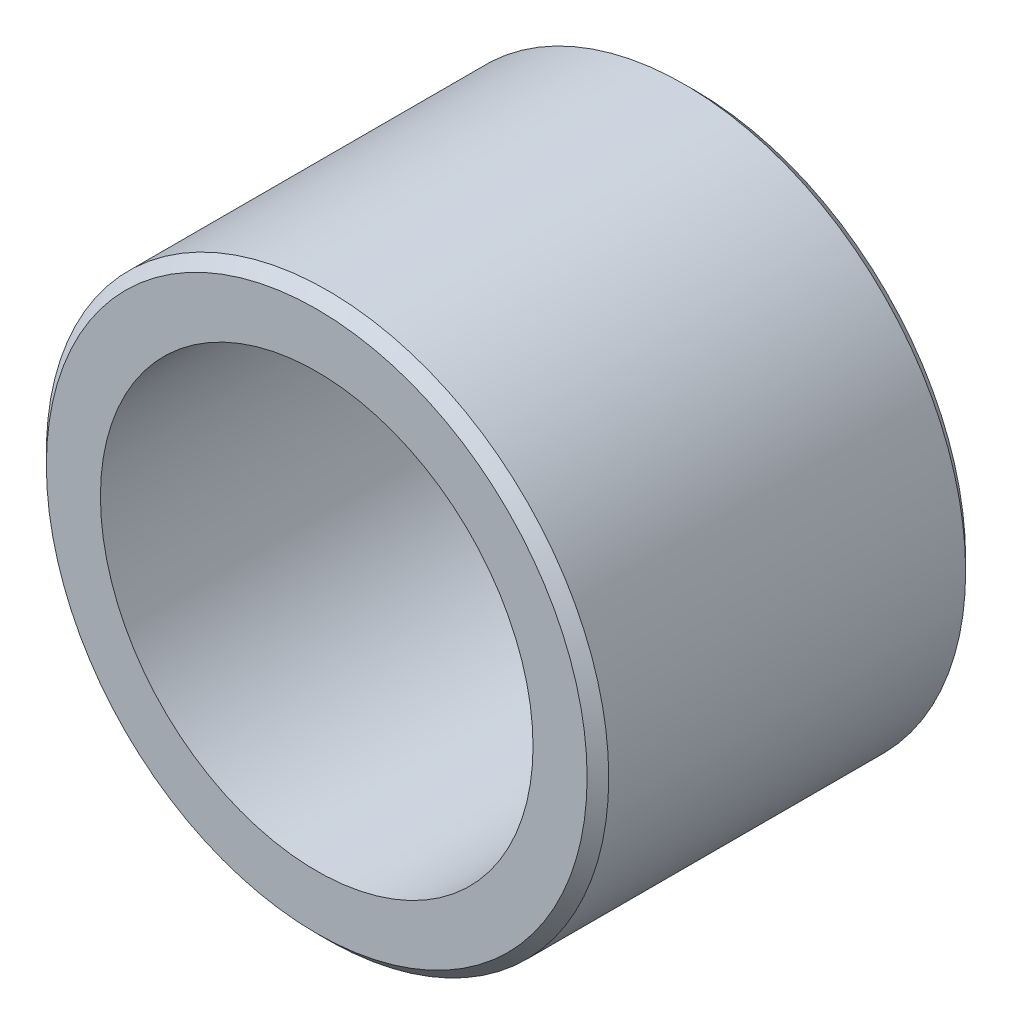
ISO-10303-21;
HEADER;
FILE_DESCRIPTION(('STEP AP214'),'2;1');
FILE_NAME('part.step','',(''),(''),'','','');
FILE_SCHEMA(('AUTOMOTIVE_DESIGN { 1 0 10303 214 1 1 1 1 }'));
ENDSEC;
DATA;
#1=APPLICATION_CONTEXT('core data for automotive mechanical design processes');
#2=APPLICATION_PROTOCOL_DEFINITION('international standard','automotive_design',2000,#1);
#3=PRODUCT_CONTEXT('',#1,'mechanical');
#4=PRODUCT('Part','Part','',(#3));
#5=PRODUCT_RELATED_PRODUCT_CATEGORY('part','',(#4));
#6=PRODUCT_DEFINITION_FORMATION('','',#4);
#7=PRODUCT_DEFINITION_CONTEXT('part definition',#1,'design');
#8=PRODUCT_DEFINITION('design','',#6,#7);
#9=PRODUCT_DEFINITION_SHAPE('','',#8);
#10=(LENGTH_UNIT() NAMED_UNIT(*) SI_UNIT(.MILLI.,.METRE.));
#11=(NAMED_UNIT(*) PLANE_ANGLE_UNIT() SI_UNIT($,.RADIAN.));
#12=(NAMED_UNIT(*) SI_UNIT($,.STERADIAN.) SOLID_ANGLE_UNIT());
#13=UNCERTAINTY_MEASURE_WITH_UNIT(LENGTH_MEASURE(1.E-05),#10,'distance_accuracy_value','');
#14=(GEOMETRIC_REPRESENTATION_CONTEXT(3) GLOBAL_UNCERTAINTY_ASSIGNED_CONTEXT((#13)) GLOBAL_UNIT_ASSIGNED_CONTEXT((#10,
#11,#12)) REPRESENTATION_CONTEXT('',''));
#15=CARTESIAN_POINT('',(0.,0.,0.));
#16=DIRECTION('',(0.,0.,1.));
#17=DIRECTION('',(1.,0.,0.));
#18=AXIS2_PLACEMENT_3D('',#15,#16,#17);
#19=CARTESIAN_POINT('',(0.,0.,17.5));
#20=DIRECTION('',(0.,0.,-1.));
#21=DIRECTION('',(-1.,0.,0.));
#22=AXIS2_PLACEMENT_3D('',#19,#20,#21);
#23=CYLINDRICAL_SURFACE('',#22,13.);
#24=CARTESIAN_POINT('',(0.,0.,0.499999999999997));
#25=DIRECTION('',(0.,0.,1.));
#26=DIRECTION('',(1.,0.,0.));
#27=AXIS2_PLACEMENT_3D('',#24,#25,#26);
#28=CIRCLE('',#27,13.);
#29=CARTESIAN_POINT('',(13.,0.,0.499999999999997));
#30=VERTEX_POINT('',#29);
#31=EDGE_CURVE('E59',#30,#30,#28,.T.);
#32=ORIENTED_EDGE('',*,*,#31,.T.);
#33=EDGE_LOOP('',(#32));
#34=FACE_BOUND('',#33,.T.);
#35=CARTESIAN_POINT('',(0.,0.,17.));
#36=DIRECTION('',(0.,0.,1.));
#37=DIRECTION('',(1.,0.,0.));
#38=AXIS2_PLACEMENT_3D('',#35,#36,#37);
#39=CIRCLE('',#38,13.);
#40=CARTESIAN_POINT('',(13.,0.,17.));
#41=VERTEX_POINT('',#40);
#42=EDGE_CURVE('E64',#41,#41,#39,.F.);
#43=ORIENTED_EDGE('',*,*,#42,.T.);
#44=EDGE_LOOP('',(#43));
#45=FACE_BOUND('',#44,.T.);
#46=ADVANCED_FACE('F45',(#34,#45),#23,.T.);
#47=CARTESIAN_POINT('',(0.,0.,17.5));
#48=DIRECTION('',(0.,0.,1.));
#49=DIRECTION('',(1.,0.,0.));
#50=AXIS2_PLACEMENT_3D('',#47,#48,#49);
#51=PLANE('',#50);
#52=CARTESIAN_POINT('',(0.,0.,17.5));
#53=DIRECTION('',(0.,0.,1.));
#54=DIRECTION('',(1.,0.,0.));
#55=AXIS2_PLACEMENT_3D('',#52,#53,#54);
#56=CIRCLE('',#55,12.5);
#57=CARTESIAN_POINT('',(12.5,0.,17.5));
#58=VERTEX_POINT('',#57);
#59=EDGE_CURVE('E10',#58,#58,#56,.T.);
#60=ORIENTED_EDGE('',*,*,#59,.T.);
#61=EDGE_LOOP('',(#60));
#62=FACE_BOUND('',#61,.T.);
#63=CARTESIAN_POINT('',(0.,0.,17.5));
#64=DIRECTION('',(0.,0.,1.));
#65=DIRECTION('',(1.,0.,0.));
#66=AXIS2_PLACEMENT_3D('',#63,#64,#65);
#67=CIRCLE('',#66,10.);
#68=CARTESIAN_POINT('',(10.,0.,17.5));
#69=VERTEX_POINT('',#68);
#70=EDGE_CURVE('E71',#69,#69,#67,.T.);
#71=ORIENTED_EDGE('',*,*,#70,.F.);
#72=EDGE_LOOP('',(#71));
#73=FACE_BOUND('',#72,.T.);
#74=ADVANCED_FACE('F88',(#62,#73),#51,.T.);
#75=CARTESIAN_POINT('',(0.,0.,0.));
#76=DIRECTION('',(0.,0.,1.));
#77=DIRECTION('',(1.,0.,0.));
#78=AXIS2_PLACEMENT_3D('',#75,#76,#77);
#79=PLANE('',#78);
#80=CARTESIAN_POINT('',(0.,0.,0.));
#81=DIRECTION('',(0.,0.,1.));
#82=DIRECTION('',(1.,0.,0.));
#83=AXIS2_PLACEMENT_3D('',#80,#81,#82);
#84=CIRCLE('',#83,12.5);
#85=CARTESIAN_POINT('',(12.5,0.,0.));
#86=VERTEX_POINT('',#85);
#87=EDGE_CURVE('E54',#86,#86,#84,.F.);
#88=ORIENTED_EDGE('',*,*,#87,.T.);
#89=EDGE_LOOP('',(#88));
#90=FACE_BOUND('',#89,.T.);
#91=CARTESIAN_POINT('',(0.,0.,0.));
#92=DIRECTION('',(0.,0.,1.));
#93=DIRECTION('',(1.,0.,0.));
#94=AXIS2_PLACEMENT_3D('',#91,#92,#93);
#95=CIRCLE('',#94,10.);
#96=CARTESIAN_POINT('',(10.,0.,0.));
#97=VERTEX_POINT('',#96);
#98=EDGE_CURVE('E70',#97,#97,#95,.T.);
#99=ORIENTED_EDGE('',*,*,#98,.T.);
#100=EDGE_LOOP('',(#99));
#101=FACE_BOUND('',#100,.T.);
#102=ADVANCED_FACE('F79',(#90,#101),#79,.F.);
#103=CARTESIAN_POINT('',(0.,0.,0.));
#104=DIRECTION('',(0.,0.,1.));
#105=DIRECTION('',(1.,0.,0.));
#106=AXIS2_PLACEMENT_3D('',#103,#104,#105);
#107=CYLINDRICAL_SURFACE('',#106,10.);
#108=ORIENTED_EDGE('',*,*,#98,.F.);
#109=EDGE_LOOP('',(#108));
#110=FACE_BOUND('',#109,.T.);
#111=ORIENTED_EDGE('',*,*,#70,.T.);
#112=EDGE_LOOP('',(#111));
#113=FACE_BOUND('',#112,.T.);
#114=ADVANCED_FACE('F81',(#110,#113),#107,.F.);
#115=CARTESIAN_POINT('',(0.,0.,0.499999999999997));
#116=DIRECTION('',(0.,0.,1.));
#117=DIRECTION('',(1.,0.,0.));
#118=AXIS2_PLACEMENT_3D('',#115,#116,#117);
#119=CONICAL_SURFACE('',#118,13.,0.785398163397452);
#120=ORIENTED_EDGE('',*,*,#87,.F.);
#121=EDGE_LOOP('',(#120));
#122=FACE_BOUND('',#121,.T.);
#123=ORIENTED_EDGE('',*,*,#31,.F.);
#124=EDGE_LOOP('',(#123));
#125=FACE_BOUND('',#124,.T.);
#126=ADVANCED_FACE('F84',(#122,#125),#119,.T.);
#127=CARTESIAN_POINT('',(0.,0.,17.5));
#128=DIRECTION('',(0.,0.,-1.));
#129=DIRECTION('',(-1.,0.,0.));
#130=AXIS2_PLACEMENT_3D('',#127,#128,#129);
#131=CONICAL_SURFACE('',#130,12.5,0.78539816339745);
#132=ORIENTED_EDGE('',*,*,#42,.F.);
#133=EDGE_LOOP('',(#132));
#134=FACE_BOUND('',#133,.T.);
#135=ORIENTED_EDGE('',*,*,#59,.F.);
#136=EDGE_LOOP('',(#135));
#137=FACE_BOUND('',#136,.T.);
#138=ADVANCED_FACE('F48',(#134,#137),#131,.T.);
#139=CLOSED_SHELL('',(#46,#74,#102,#114,#126,#138));
#140=MANIFOLD_SOLID_BREP('B2',#139);
#141=ADVANCED_BREP_SHAPE_REPRESENTATION('',(#18,#140),#14);
#142=SHAPE_DEFINITION_REPRESENTATION(#9,#141);
ENDSEC;
END-ISO-10303-21;
